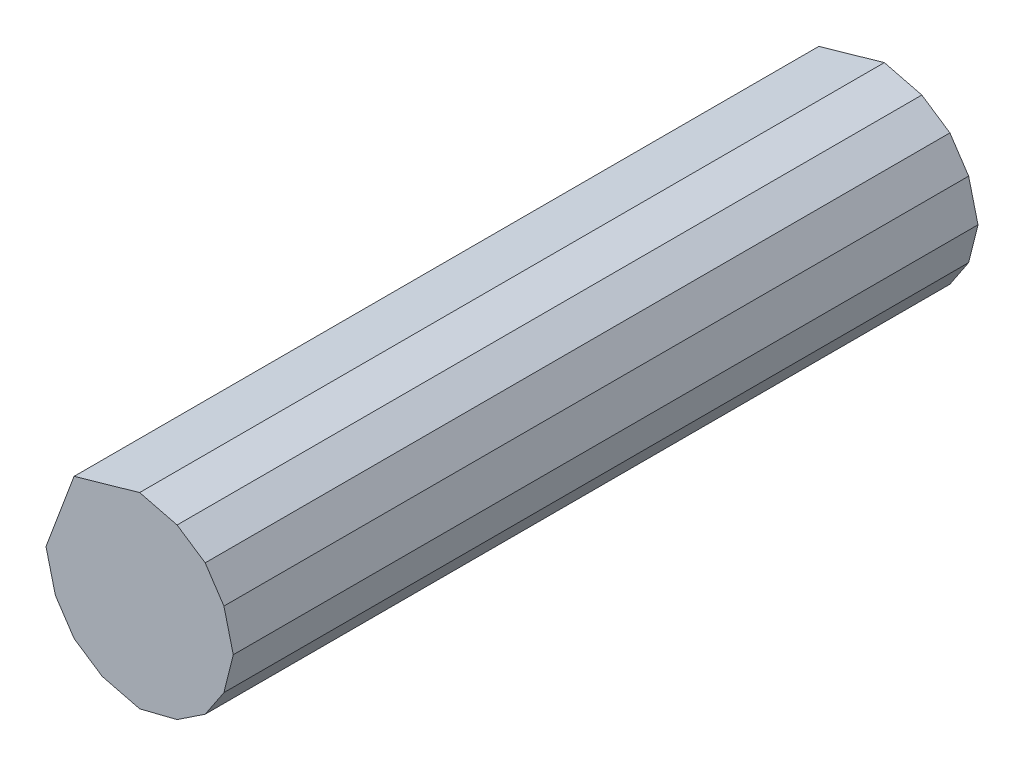
ISO-10303-21;
HEADER;
FILE_DESCRIPTION(('STEP AP214'),'2;1');
FILE_NAME('part.step','',(''),(''),'','','');
FILE_SCHEMA(('AUTOMOTIVE_DESIGN { 1 0 10303 214 1 1 1 1 }'));
ENDSEC;
DATA;
#1=APPLICATION_CONTEXT('core data for automotive mechanical design processes');
#2=APPLICATION_PROTOCOL_DEFINITION('international standard','automotive_design',2000,#1);
#3=PRODUCT_CONTEXT('',#1,'mechanical');
#4=PRODUCT('Part','Part','',(#3));
#5=PRODUCT_RELATED_PRODUCT_CATEGORY('part','',(#4));
#6=PRODUCT_DEFINITION_FORMATION('','',#4);
#7=PRODUCT_DEFINITION_CONTEXT('part definition',#1,'design');
#8=PRODUCT_DEFINITION('design','',#6,#7);
#9=PRODUCT_DEFINITION_SHAPE('','',#8);
#10=(LENGTH_UNIT() NAMED_UNIT(*) SI_UNIT(.MILLI.,.METRE.));
#11=(NAMED_UNIT(*) PLANE_ANGLE_UNIT() SI_UNIT($,.RADIAN.));
#12=(NAMED_UNIT(*) SI_UNIT($,.STERADIAN.) SOLID_ANGLE_UNIT());
#13=UNCERTAINTY_MEASURE_WITH_UNIT(LENGTH_MEASURE(1.E-05),#10,'distance_accuracy_value','');
#14=(GEOMETRIC_REPRESENTATION_CONTEXT(3) GLOBAL_UNCERTAINTY_ASSIGNED_CONTEXT((#13)) GLOBAL_UNIT_ASSIGNED_CONTEXT((#10,
#11,#12)) REPRESENTATION_CONTEXT('',''));
#15=CARTESIAN_POINT('',(0.,0.,0.));
#16=DIRECTION('',(0.,0.,1.));
#17=DIRECTION('',(1.,0.,0.));
#18=AXIS2_PLACEMENT_3D('',#15,#16,#17);
#19=CARTESIAN_POINT('',(0.889,-0.889,0.));
#20=DIRECTION('',(-0.832050294337997,0.554700196224998,0.));
#21=DIRECTION('',(-0.554700196224998,-0.832050294337997,0.));
#22=AXIS2_PLACEMENT_3D('',#19,#20,#21);
#23=PLANE('',#22);
#24=DIRECTION('',(0.,0.,1.));
#25=VECTOR('',#24,1.);
#26=CARTESIAN_POINT('',(1.143,-0.508,0.));
#27=LINE('',#26,#25);
#28=CARTESIAN_POINT('',(1.14299999999995,-0.507999999999965,0.));
#29=VERTEX_POINT('',#28);
#30=CARTESIAN_POINT('',(1.14299999999995,-0.507999999999965,10.1));
#31=VERTEX_POINT('',#30);
#32=EDGE_CURVE('E130',#29,#31,#27,.T.);
#33=ORIENTED_EDGE('',*,*,#32,.T.);
#34=DIRECTION('',(-0.554700196224998,-0.832050294337997,0.));
#35=VECTOR('',#34,1.);
#36=CARTESIAN_POINT('',(0.889,-0.889,10.1));
#37=LINE('',#36,#35);
#38=CARTESIAN_POINT('',(0.889000000000018,-0.889000000000027,10.1));
#39=VERTEX_POINT('',#38);
#40=EDGE_CURVE('E20',#39,#31,#37,.F.);
#41=ORIENTED_EDGE('',*,*,#40,.F.);
#42=DIRECTION('',(0.,0.,1.));
#43=VECTOR('',#42,1.);
#44=CARTESIAN_POINT('',(0.889000000000071,-0.889000000000106,0.));
#45=LINE('',#44,#43);
#46=CARTESIAN_POINT('',(0.889000000000018,-0.889000000000026,0.));
#47=VERTEX_POINT('',#46);
#48=EDGE_CURVE('E140',#39,#47,#45,.F.);
#49=ORIENTED_EDGE('',*,*,#48,.T.);
#50=DIRECTION('',(-0.554700196224998,-0.832050294337997,0.));
#51=VECTOR('',#50,1.);
#52=CARTESIAN_POINT('',(0.889,-0.889,0.));
#53=LINE('',#52,#51);
#54=EDGE_CURVE('E114',#29,#47,#53,.T.);
#55=ORIENTED_EDGE('',*,*,#54,.F.);
#56=EDGE_LOOP('',(#33,#41,#49,#55));
#57=FACE_BOUND('',#56,.T.);
#58=ADVANCED_FACE('F17',(#57),#23,.F.);
#59=CARTESIAN_POINT('',(1.143,-0.508,0.));
#60=DIRECTION('',(-0.970142500145391,0.242535625036098,0.));
#61=DIRECTION('',(-0.242535625036098,-0.970142500145391,0.));
#62=AXIS2_PLACEMENT_3D('',#59,#60,#61);
#63=PLANE('',#62);
#64=DIRECTION('',(0.,0.,1.));
#65=VECTOR('',#64,1.);
#66=CARTESIAN_POINT('',(1.27,0.,0.));
#67=LINE('',#66,#65);
#68=CARTESIAN_POINT('',(1.26999999999994,0.,0.));
#69=VERTEX_POINT('',#68);
#70=CARTESIAN_POINT('',(1.26999999999994,0.,10.1));
#71=VERTEX_POINT('',#70);
#72=EDGE_CURVE('E133',#69,#71,#67,.T.);
#73=ORIENTED_EDGE('',*,*,#72,.T.);
#74=DIRECTION('',(-0.242535625036098,-0.970142500145391,0.));
#75=VECTOR('',#74,1.);
#76=CARTESIAN_POINT('',(1.143,-0.508,10.1));
#77=LINE('',#76,#75);
#78=EDGE_CURVE('E122',#31,#71,#77,.F.);
#79=ORIENTED_EDGE('',*,*,#78,.F.);
#80=ORIENTED_EDGE('',*,*,#32,.F.);
#81=DIRECTION('',(-0.242535625036098,-0.970142500145391,0.));
#82=VECTOR('',#81,1.);
#83=CARTESIAN_POINT('',(1.143,-0.508,0.));
#84=LINE('',#83,#82);
#85=EDGE_CURVE('E134',#69,#29,#84,.T.);
#86=ORIENTED_EDGE('',*,*,#85,.F.);
#87=EDGE_LOOP('',(#73,#79,#80,#86));
#88=FACE_BOUND('',#87,.T.);
#89=ADVANCED_FACE('F129',(#88),#63,.F.);
#90=CARTESIAN_POINT('',(0.508,-1.143,0.));
#91=DIRECTION('',(-0.554700196224998,0.832050294337997,0.));
#92=DIRECTION('',(-0.832050294337997,-0.554700196224998,0.));
#93=AXIS2_PLACEMENT_3D('',#90,#91,#92);
#94=PLANE('',#93);
#95=ORIENTED_EDGE('',*,*,#48,.F.);
#96=DIRECTION('',(-0.832050294337997,-0.554700196224998,0.));
#97=VECTOR('',#96,1.);
#98=CARTESIAN_POINT('',(0.508,-1.143,10.1));
#99=LINE('',#98,#97);
#100=CARTESIAN_POINT('',(0.508000000000007,-1.14300000000003,10.1));
#101=VERTEX_POINT('',#100);
#102=EDGE_CURVE('E125',#101,#39,#99,.F.);
#103=ORIENTED_EDGE('',*,*,#102,.F.);
#104=DIRECTION('',(0.,0.,1.));
#105=VECTOR('',#104,1.);
#106=CARTESIAN_POINT('',(0.508000000000031,-1.14300000000012,0.));
#107=LINE('',#106,#105);
#108=CARTESIAN_POINT('',(0.508000000000008,-1.14300000000003,0.));
#109=VERTEX_POINT('',#108);
#110=EDGE_CURVE('E152',#101,#109,#107,.F.);
#111=ORIENTED_EDGE('',*,*,#110,.T.);
#112=DIRECTION('',(-0.832050294337997,-0.554700196224998,0.));
#113=VECTOR('',#112,1.);
#114=CARTESIAN_POINT('',(0.508,-1.143,0.));
#115=LINE('',#114,#113);
#116=EDGE_CURVE('E142',#47,#109,#115,.T.);
#117=ORIENTED_EDGE('',*,*,#116,.F.);
#118=EDGE_LOOP('',(#95,#103,#111,#117));
#119=FACE_BOUND('',#118,.T.);
#120=ADVANCED_FACE('F286',(#119),#94,.F.);
#121=CARTESIAN_POINT('',(1.27,0.,0.));
#122=DIRECTION('',(-0.970142500145391,-0.242535625036098,0.));
#123=DIRECTION('',(0.242535625036098,-0.970142500145391,0.));
#124=AXIS2_PLACEMENT_3D('',#121,#122,#123);
#125=PLANE('',#124);
#126=DIRECTION('',(0.,0.,1.));
#127=VECTOR('',#126,1.);
#128=CARTESIAN_POINT('',(1.143,0.508,0.));
#129=LINE('',#128,#127);
#130=CARTESIAN_POINT('',(1.14300000000006,0.508000000000015,0.));
#131=VERTEX_POINT('',#130);
#132=CARTESIAN_POINT('',(1.14300000000006,0.508000000000015,10.1));
#133=VERTEX_POINT('',#132);
#134=EDGE_CURVE('E157',#131,#133,#129,.T.);
#135=ORIENTED_EDGE('',*,*,#134,.T.);
#136=DIRECTION('',(0.242535625036098,-0.970142500145391,0.));
#137=VECTOR('',#136,1.);
#138=CARTESIAN_POINT('',(1.27,0.,10.1));
#139=LINE('',#138,#137);
#140=EDGE_CURVE('E145',#71,#133,#139,.F.);
#141=ORIENTED_EDGE('',*,*,#140,.F.);
#142=ORIENTED_EDGE('',*,*,#72,.F.);
#143=DIRECTION('',(0.242535625036098,-0.970142500145391,0.));
#144=VECTOR('',#143,1.);
#145=CARTESIAN_POINT('',(1.27,0.,0.));
#146=LINE('',#145,#144);
#147=EDGE_CURVE('E147',#131,#69,#146,.T.);
#148=ORIENTED_EDGE('',*,*,#147,.F.);
#149=EDGE_LOOP('',(#135,#141,#142,#148));
#150=FACE_BOUND('',#149,.T.);
#151=ADVANCED_FACE('F282',(#150),#125,.F.);
#152=CARTESIAN_POINT('',(0.,-1.27,0.));
#153=DIRECTION('',(-0.242535625036098,0.970142500145391,0.));
#154=DIRECTION('',(-0.970142500145391,-0.242535625036098,0.));
#155=AXIS2_PLACEMENT_3D('',#152,#153,#154);
#156=PLANE('',#155);
#157=ORIENTED_EDGE('',*,*,#110,.F.);
#158=DIRECTION('',(-0.970142500145391,-0.242535625036098,0.));
#159=VECTOR('',#158,1.);
#160=CARTESIAN_POINT('',(0.,-1.27,10.1));
#161=LINE('',#160,#159);
#162=CARTESIAN_POINT('',(0.,-1.26999999999997,10.1));
#163=VERTEX_POINT('',#162);
#164=EDGE_CURVE('E150',#163,#101,#161,.F.);
#165=ORIENTED_EDGE('',*,*,#164,.F.);
#166=DIRECTION('',(0.,0.,1.));
#167=VECTOR('',#166,1.);
#168=CARTESIAN_POINT('',(0.,-1.26999999999988,0.));
#169=LINE('',#168,#167);
#170=CARTESIAN_POINT('',(0.,-1.26999999999997,0.));
#171=VERTEX_POINT('',#170);
#172=EDGE_CURVE('E168',#163,#171,#169,.F.);
#173=ORIENTED_EDGE('',*,*,#172,.T.);
#174=DIRECTION('',(-0.970142500145391,-0.242535625036098,0.));
#175=VECTOR('',#174,1.);
#176=CARTESIAN_POINT('',(0.,-1.27,0.));
#177=LINE('',#176,#175);
#178=EDGE_CURVE('E155',#109,#171,#177,.T.);
#179=ORIENTED_EDGE('',*,*,#178,.F.);
#180=EDGE_LOOP('',(#157,#165,#173,#179));
#181=FACE_BOUND('',#180,.T.);
#182=ADVANCED_FACE('F278',(#181),#156,.F.);
#183=CARTESIAN_POINT('',(1.143,0.508,0.));
#184=DIRECTION('',(-0.832050294337997,-0.554700196224998,0.));
#185=DIRECTION('',(0.554700196224998,-0.832050294337997,0.));
#186=AXIS2_PLACEMENT_3D('',#183,#184,#185);
#187=PLANE('',#186);
#188=DIRECTION('',(0.,0.,1.));
#189=VECTOR('',#188,1.);
#190=CARTESIAN_POINT('',(0.889,0.889,0.));
#191=LINE('',#190,#189);
#192=CARTESIAN_POINT('',(0.889000000000053,0.889000000000035,0.));
#193=VERTEX_POINT('',#192);
#194=CARTESIAN_POINT('',(0.889000000000053,0.889000000000035,10.1));
#195=VERTEX_POINT('',#194);
#196=EDGE_CURVE('E173',#193,#195,#191,.T.);
#197=ORIENTED_EDGE('',*,*,#196,.T.);
#198=DIRECTION('',(0.554700196224998,-0.832050294337997,0.));
#199=VECTOR('',#198,1.);
#200=CARTESIAN_POINT('',(1.143,0.508,10.1));
#201=LINE('',#200,#199);
#202=EDGE_CURVE('E160',#133,#195,#201,.F.);
#203=ORIENTED_EDGE('',*,*,#202,.F.);
#204=ORIENTED_EDGE('',*,*,#134,.F.);
#205=DIRECTION('',(0.554700196224998,-0.832050294337997,0.));
#206=VECTOR('',#205,1.);
#207=CARTESIAN_POINT('',(1.143,0.508,0.));
#208=LINE('',#207,#206);
#209=EDGE_CURVE('E162',#193,#131,#208,.T.);
#210=ORIENTED_EDGE('',*,*,#209,.F.);
#211=EDGE_LOOP('',(#197,#203,#204,#210));
#212=FACE_BOUND('',#211,.T.);
#213=ADVANCED_FACE('F274',(#212),#187,.F.);
#214=CARTESIAN_POINT('',(-0.508,-1.143,0.));
#215=DIRECTION('',(0.242535625036098,0.970142500145391,0.));
#216=DIRECTION('',(-0.970142500145391,0.242535625036098,0.));
#217=AXIS2_PLACEMENT_3D('',#214,#215,#216);
#218=PLANE('',#217);
#219=ORIENTED_EDGE('',*,*,#172,.F.);
#220=DIRECTION('',(-0.970142500145391,0.242535625036098,0.));
#221=VECTOR('',#220,1.);
#222=CARTESIAN_POINT('',(-0.508,-1.143,10.1));
#223=LINE('',#222,#221);
#224=CARTESIAN_POINT('',(-0.507999999999983,-1.14299999999997,10.1));
#225=VERTEX_POINT('',#224);
#226=EDGE_CURVE('E165',#225,#163,#223,.F.);
#227=ORIENTED_EDGE('',*,*,#226,.F.);
#228=DIRECTION('',(0.,0.,1.));
#229=VECTOR('',#228,1.);
#230=CARTESIAN_POINT('',(-0.50799999999993,-1.14299999999989,0.));
#231=LINE('',#230,#229);
#232=CARTESIAN_POINT('',(-0.507999999999982,-1.14299999999997,0.));
#233=VERTEX_POINT('',#232);
#234=EDGE_CURVE('E184',#225,#233,#231,.F.);
#235=ORIENTED_EDGE('',*,*,#234,.T.);
#236=DIRECTION('',(-0.970142500145391,0.242535625036098,0.));
#237=VECTOR('',#236,1.);
#238=CARTESIAN_POINT('',(-0.508,-1.143,0.));
#239=LINE('',#238,#237);
#240=EDGE_CURVE('E171',#171,#233,#239,.T.);
#241=ORIENTED_EDGE('',*,*,#240,.F.);
#242=EDGE_LOOP('',(#219,#227,#235,#241));
#243=FACE_BOUND('',#242,.T.);
#244=ADVANCED_FACE('F270',(#243),#218,.F.);
#245=CARTESIAN_POINT('',(0.889,0.889,0.));
#246=DIRECTION('',(-0.554700196224998,-0.832050294337997,0.));
#247=DIRECTION('',(0.832050294337997,-0.554700196224998,0.));
#248=AXIS2_PLACEMENT_3D('',#245,#246,#247);
#249=PLANE('',#248);
#250=DIRECTION('',(0.,0.,1.));
#251=VECTOR('',#250,1.);
#252=CARTESIAN_POINT('',(0.508,1.143,0.));
#253=LINE('',#252,#251);
#254=CARTESIAN_POINT('',(0.507999999999965,1.14299999999995,0.));
#255=VERTEX_POINT('',#254);
#256=CARTESIAN_POINT('',(0.507999999999965,1.14299999999995,10.1));
#257=VERTEX_POINT('',#256);
#258=EDGE_CURVE('E189',#255,#257,#253,.T.);
#259=ORIENTED_EDGE('',*,*,#258,.T.);
#260=DIRECTION('',(0.832050294337997,-0.554700196224998,0.));
#261=VECTOR('',#260,1.);
#262=CARTESIAN_POINT('',(0.889,0.889,10.1));
#263=LINE('',#262,#261);
#264=EDGE_CURVE('E176',#195,#257,#263,.F.);
#265=ORIENTED_EDGE('',*,*,#264,.F.);
#266=ORIENTED_EDGE('',*,*,#196,.F.);
#267=DIRECTION('',(0.832050294337997,-0.554700196224998,0.));
#268=VECTOR('',#267,1.);
#269=CARTESIAN_POINT('',(0.889,0.889,0.));
#270=LINE('',#269,#268);
#271=EDGE_CURVE('E178',#255,#193,#270,.T.);
#272=ORIENTED_EDGE('',*,*,#271,.F.);
#273=EDGE_LOOP('',(#259,#265,#266,#272));
#274=FACE_BOUND('',#273,.T.);
#275=ADVANCED_FACE('F266',(#274),#249,.F.);
#276=CARTESIAN_POINT('',(-0.889,-0.889,0.));
#277=DIRECTION('',(0.554700196224998,0.832050294337997,0.));
#278=DIRECTION('',(-0.832050294337997,0.554700196224998,0.));
#279=AXIS2_PLACEMENT_3D('',#276,#277,#278);
#280=PLANE('',#279);
#281=ORIENTED_EDGE('',*,*,#234,.F.);
#282=DIRECTION('',(-0.832050294337997,0.554700196224998,0.));
#283=VECTOR('',#282,1.);
#284=CARTESIAN_POINT('',(-0.889,-0.889,10.1));
#285=LINE('',#284,#283);
#286=CARTESIAN_POINT('',(-0.889000000000026,-0.889000000000018,10.1));
#287=VERTEX_POINT('',#286);
#288=EDGE_CURVE('E181',#287,#225,#285,.F.);
#289=ORIENTED_EDGE('',*,*,#288,.F.);
#290=DIRECTION('',(0.,0.,1.));
#291=VECTOR('',#290,1.);
#292=CARTESIAN_POINT('',(-0.889000000000106,-0.889000000000071,0.));
#293=LINE('',#292,#291);
#294=CARTESIAN_POINT('',(-0.889000000000026,-0.889000000000018,0.));
#295=VERTEX_POINT('',#294);
#296=EDGE_CURVE('E197',#287,#295,#293,.F.);
#297=ORIENTED_EDGE('',*,*,#296,.T.);
#298=DIRECTION('',(-0.832050294337997,0.554700196224998,0.));
#299=VECTOR('',#298,1.);
#300=CARTESIAN_POINT('',(-0.889,-0.889,0.));
#301=LINE('',#300,#299);
#302=EDGE_CURVE('E187',#233,#295,#301,.T.);
#303=ORIENTED_EDGE('',*,*,#302,.F.);
#304=EDGE_LOOP('',(#281,#289,#297,#303));
#305=FACE_BOUND('',#304,.T.);
#306=ADVANCED_FACE('F262',(#305),#280,.F.);
#307=CARTESIAN_POINT('',(0.508,1.143,0.));
#308=DIRECTION('',(-0.242535625036098,-0.970142500145391,0.));
#309=DIRECTION('',(0.970142500145391,-0.242535625036098,0.));
#310=AXIS2_PLACEMENT_3D('',#307,#308,#309);
#311=PLANE('',#310);
#312=DIRECTION('',(0.,0.,1.));
#313=VECTOR('',#312,1.);
#314=CARTESIAN_POINT('',(0.,1.27,0.));
#315=LINE('',#314,#313);
#316=CARTESIAN_POINT('',(0.,1.26999999999994,0.));
#317=VERTEX_POINT('',#316);
#318=CARTESIAN_POINT('',(0.,1.26999999999994,10.1));
#319=VERTEX_POINT('',#318);
#320=EDGE_CURVE('E202',#317,#319,#315,.T.);
#321=ORIENTED_EDGE('',*,*,#320,.T.);
#322=DIRECTION('',(0.970142500145391,-0.242535625036098,0.));
#323=VECTOR('',#322,1.);
#324=CARTESIAN_POINT('',(0.508,1.143,10.1));
#325=LINE('',#324,#323);
#326=EDGE_CURVE('E192',#257,#319,#325,.F.);
#327=ORIENTED_EDGE('',*,*,#326,.F.);
#328=ORIENTED_EDGE('',*,*,#258,.F.);
#329=DIRECTION('',(0.970142500145391,-0.242535625036098,0.));
#330=VECTOR('',#329,1.);
#331=CARTESIAN_POINT('',(0.508,1.143,0.));
#332=LINE('',#331,#330);
#333=EDGE_CURVE('E194',#317,#255,#332,.T.);
#334=ORIENTED_EDGE('',*,*,#333,.F.);
#335=EDGE_LOOP('',(#321,#327,#328,#334));
#336=FACE_BOUND('',#335,.T.);
#337=ADVANCED_FACE('F258',(#336),#311,.F.);
#338=CARTESIAN_POINT('',(-1.143,-0.508,0.));
#339=DIRECTION('',(0.832050294337997,0.554700196224998,0.));
#340=DIRECTION('',(-0.554700196224998,0.832050294337997,0.));
#341=AXIS2_PLACEMENT_3D('',#338,#339,#340);
#342=PLANE('',#341);
#343=ORIENTED_EDGE('',*,*,#296,.F.);
#344=DIRECTION('',(-0.554700196225229,0.832050294337844,0.));
#345=VECTOR('',#344,1.);
#346=CARTESIAN_POINT('',(-0.889,-0.889,10.1));
#347=LINE('',#346,#345);
#348=CARTESIAN_POINT('',(-1.14300000000003,-0.508000000000008,10.1));
#349=VERTEX_POINT('',#348);
#350=EDGE_CURVE('E208',#287,#349,#347,.T.);
#351=ORIENTED_EDGE('',*,*,#350,.T.);
#352=DIRECTION('',(0.,0.,1.));
#353=VECTOR('',#352,1.);
#354=CARTESIAN_POINT('',(-1.14300000000012,-0.508000000000031,0.));
#355=LINE('',#354,#353);
#356=CARTESIAN_POINT('',(-1.14300000000003,-0.508000000000008,0.));
#357=VERTEX_POINT('',#356);
#358=EDGE_CURVE('E213',#349,#357,#355,.F.);
#359=ORIENTED_EDGE('',*,*,#358,.T.);
#360=DIRECTION('',(-0.554700196224998,0.832050294337997,0.));
#361=VECTOR('',#360,1.);
#362=CARTESIAN_POINT('',(-1.143,-0.508,0.));
#363=LINE('',#362,#361);
#364=EDGE_CURVE('E200',#295,#357,#363,.T.);
#365=ORIENTED_EDGE('',*,*,#364,.F.);
#366=EDGE_LOOP('',(#343,#351,#359,#365));
#367=FACE_BOUND('',#366,.T.);
#368=ADVANCED_FACE('F255',(#367),#342,.F.);
#369=CARTESIAN_POINT('',(0.,1.27,0.));
#370=DIRECTION('',(0.274721127896982,-0.961523947640936,0.));
#371=DIRECTION('',(0.961523947640936,0.274721127896982,0.));
#372=AXIS2_PLACEMENT_3D('',#369,#370,#371);
#373=PLANE('',#372);
#374=DIRECTION('',(0.,0.,1.));
#375=VECTOR('',#374,1.);
#376=CARTESIAN_POINT('',(-0.889,1.016,0.));
#377=LINE('',#376,#375);
#378=CARTESIAN_POINT('',(-0.889000000000053,1.01600000000018,0.));
#379=VERTEX_POINT('',#378);
#380=CARTESIAN_POINT('',(-0.889000000000053,1.01600000000018,10.1));
#381=VERTEX_POINT('',#380);
#382=EDGE_CURVE('E220',#379,#381,#377,.T.);
#383=ORIENTED_EDGE('',*,*,#382,.T.);
#384=DIRECTION('',(0.961523947640823,0.274721127897378,0.));
#385=VECTOR('',#384,1.);
#386=CARTESIAN_POINT('',(-0.889,1.016,10.1));
#387=LINE('',#386,#385);
#388=EDGE_CURVE('E205',#381,#319,#387,.T.);
#389=ORIENTED_EDGE('',*,*,#388,.T.);
#390=ORIENTED_EDGE('',*,*,#320,.F.);
#391=DIRECTION('',(0.961523947640823,0.274721127897378,0.));
#392=VECTOR('',#391,1.);
#393=CARTESIAN_POINT('',(-0.889,1.016,0.));
#394=LINE('',#393,#392);
#395=EDGE_CURVE('E216',#379,#317,#394,.T.);
#396=ORIENTED_EDGE('',*,*,#395,.F.);
#397=EDGE_LOOP('',(#383,#389,#390,#396));
#398=FACE_BOUND('',#397,.T.);
#399=ADVANCED_FACE('F237',(#398),#373,.F.);
#400=CARTESIAN_POINT('',(-1.27,0.,10.1));
#401=DIRECTION('',(0.,0.,-1.));
#402=DIRECTION('',(-1.,0.,0.));
#403=AXIS2_PLACEMENT_3D('',#400,#401,#402);
#404=PLANE('',#403);
#405=ORIENTED_EDGE('',*,*,#350,.F.);
#406=ORIENTED_EDGE('',*,*,#288,.T.);
#407=ORIENTED_EDGE('',*,*,#226,.T.);
#408=ORIENTED_EDGE('',*,*,#164,.T.);
#409=ORIENTED_EDGE('',*,*,#102,.T.);
#410=ORIENTED_EDGE('',*,*,#40,.T.);
#411=ORIENTED_EDGE('',*,*,#78,.T.);
#412=ORIENTED_EDGE('',*,*,#140,.T.);
#413=ORIENTED_EDGE('',*,*,#202,.T.);
#414=ORIENTED_EDGE('',*,*,#264,.T.);
#415=ORIENTED_EDGE('',*,*,#326,.T.);
#416=ORIENTED_EDGE('',*,*,#388,.F.);
#417=DIRECTION('',(0.351123441588063,0.936329177569168,0.));
#418=VECTOR('',#417,1.);
#419=CARTESIAN_POINT('',(-0.889,1.016,10.1));
#420=LINE('',#419,#418);
#421=CARTESIAN_POINT('',(-1.26999999999991,0.,10.1));
#422=VERTEX_POINT('',#421);
#423=EDGE_CURVE('E223',#381,#422,#420,.F.);
#424=ORIENTED_EDGE('',*,*,#423,.T.);
#425=DIRECTION('',(-0.242535625036098,0.970142500145391,0.));
#426=VECTOR('',#425,1.);
#427=CARTESIAN_POINT('',(-1.27,0.,10.1));
#428=LINE('',#427,#426);
#429=EDGE_CURVE('E210',#422,#349,#428,.F.);
#430=ORIENTED_EDGE('',*,*,#429,.T.);
#431=EDGE_LOOP('',(#405,#406,#407,#408,#409,#410,#411,#412,#413,#414,#415,#416,#424,#430));
#432=FACE_BOUND('',#431,.T.);
#433=ADVANCED_FACE('F121',(#432),#404,.F.);
#434=CARTESIAN_POINT('',(-1.27,0.,0.));
#435=DIRECTION('',(0.970142500145391,0.242535625036098,0.));
#436=DIRECTION('',(-0.242535625036098,0.970142500145391,0.));
#437=AXIS2_PLACEMENT_3D('',#434,#435,#436);
#438=PLANE('',#437);
#439=ORIENTED_EDGE('',*,*,#358,.F.);
#440=ORIENTED_EDGE('',*,*,#429,.F.);
#441=DIRECTION('',(0.,0.,1.));
#442=VECTOR('',#441,1.);
#443=CARTESIAN_POINT('',(-1.26999999999964,-1.33790548084711E-13,0.));
#444=LINE('',#443,#442);
#445=CARTESIAN_POINT('',(-1.26999999999991,0.,0.));
#446=VERTEX_POINT('',#445);
#447=EDGE_CURVE('E26',#422,#446,#444,.F.);
#448=ORIENTED_EDGE('',*,*,#447,.T.);
#449=DIRECTION('',(-0.242535625036333,0.970142500145332,0.));
#450=VECTOR('',#449,1.);
#451=CARTESIAN_POINT('',(-1.143,-0.508,0.));
#452=LINE('',#451,#450);
#453=EDGE_CURVE('E34',#357,#446,#452,.T.);
#454=ORIENTED_EDGE('',*,*,#453,.F.);
#455=EDGE_LOOP('',(#439,#440,#448,#454));
#456=FACE_BOUND('',#455,.T.);
#457=ADVANCED_FACE('F230',(#456),#438,.F.);
#458=CARTESIAN_POINT('',(-1.27,0.,0.));
#459=DIRECTION('',(0.,0.,-1.));
#460=DIRECTION('',(-1.,0.,0.));
#461=AXIS2_PLACEMENT_3D('',#458,#459,#460);
#462=PLANE('',#461);
#463=ORIENTED_EDGE('',*,*,#364,.T.);
#464=ORIENTED_EDGE('',*,*,#453,.T.);
#465=DIRECTION('',(0.351123441588063,0.936329177569168,0.));
#466=VECTOR('',#465,1.);
#467=CARTESIAN_POINT('',(-0.889,1.016,0.));
#468=LINE('',#467,#466);
#469=EDGE_CURVE('E11',#446,#379,#468,.T.);
#470=ORIENTED_EDGE('',*,*,#469,.T.);
#471=ORIENTED_EDGE('',*,*,#395,.T.);
#472=ORIENTED_EDGE('',*,*,#333,.T.);
#473=ORIENTED_EDGE('',*,*,#271,.T.);
#474=ORIENTED_EDGE('',*,*,#209,.T.);
#475=ORIENTED_EDGE('',*,*,#147,.T.);
#476=ORIENTED_EDGE('',*,*,#85,.T.);
#477=ORIENTED_EDGE('',*,*,#54,.T.);
#478=ORIENTED_EDGE('',*,*,#116,.T.);
#479=ORIENTED_EDGE('',*,*,#178,.T.);
#480=ORIENTED_EDGE('',*,*,#240,.T.);
#481=ORIENTED_EDGE('',*,*,#302,.T.);
#482=EDGE_LOOP('',(#463,#464,#470,#471,#472,#473,#474,#475,#476,#477,#478,#479,#480,#481));
#483=FACE_BOUND('',#482,.T.);
#484=ADVANCED_FACE('F239',(#483),#462,.T.);
#485=CARTESIAN_POINT('',(-0.889,1.016,0.));
#486=DIRECTION('',(0.936329177569168,-0.351123441588063,0.));
#487=DIRECTION('',(0.351123441588063,0.936329177569168,0.));
#488=AXIS2_PLACEMENT_3D('',#485,#486,#487);
#489=PLANE('',#488);
#490=ORIENTED_EDGE('',*,*,#447,.F.);
#491=ORIENTED_EDGE('',*,*,#423,.F.);
#492=ORIENTED_EDGE('',*,*,#382,.F.);
#493=ORIENTED_EDGE('',*,*,#469,.F.);
#494=EDGE_LOOP('',(#490,#491,#492,#493));
#495=FACE_BOUND('',#494,.T.);
#496=ADVANCED_FACE('F233',(#495),#489,.F.);
#497=CLOSED_SHELL('',(#58,#89,#120,#151,#182,#213,#244,#275,#306,#337,#368,#399,#433,#457,#484,#496));
#498=MANIFOLD_SOLID_BREP('B1',#497);
#499=ADVANCED_BREP_SHAPE_REPRESENTATION('',(#18,#498),#14);
#500=SHAPE_DEFINITION_REPRESENTATION(#9,#499);
ENDSEC;
END-ISO-10303-21;
